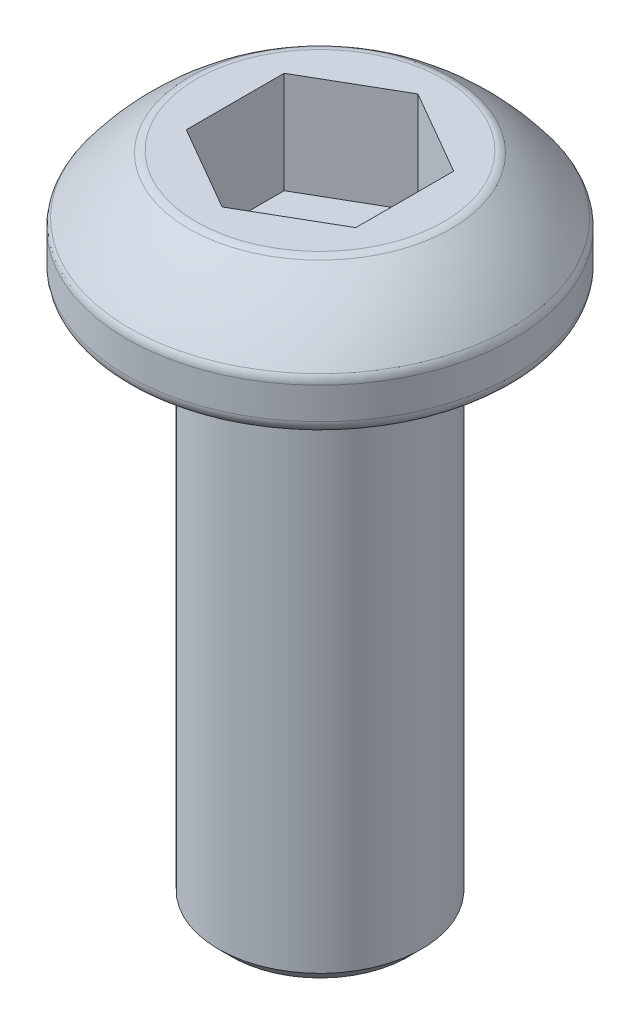
ISO-10303-21;
HEADER;
FILE_DESCRIPTION(('STEP AP214'),'2;1');
FILE_NAME('part.step','',(''),(''),'','','');
FILE_SCHEMA(('AUTOMOTIVE_DESIGN { 1 0 10303 214 1 1 1 1 }'));
ENDSEC;
DATA;
#1=APPLICATION_CONTEXT('core data for automotive mechanical design processes');
#2=APPLICATION_PROTOCOL_DEFINITION('international standard','automotive_design',2000,#1);
#3=PRODUCT_CONTEXT('',#1,'mechanical');
#4=PRODUCT('Part','Part','',(#3));
#5=PRODUCT_RELATED_PRODUCT_CATEGORY('part','',(#4));
#6=PRODUCT_DEFINITION_FORMATION('','',#4);
#7=PRODUCT_DEFINITION_CONTEXT('part definition',#1,'design');
#8=PRODUCT_DEFINITION('design','',#6,#7);
#9=PRODUCT_DEFINITION_SHAPE('','',#8);
#10=(LENGTH_UNIT() NAMED_UNIT(*) SI_UNIT(.MILLI.,.METRE.));
#11=(NAMED_UNIT(*) PLANE_ANGLE_UNIT() SI_UNIT($,.RADIAN.));
#12=(NAMED_UNIT(*) SI_UNIT($,.STERADIAN.) SOLID_ANGLE_UNIT());
#13=UNCERTAINTY_MEASURE_WITH_UNIT(LENGTH_MEASURE(1.E-05),#10,'distance_accuracy_value','');
#14=(GEOMETRIC_REPRESENTATION_CONTEXT(3) GLOBAL_UNCERTAINTY_ASSIGNED_CONTEXT((#13)) GLOBAL_UNIT_ASSIGNED_CONTEXT((#10,
#11,#12)) REPRESENTATION_CONTEXT('',''));
#15=CARTESIAN_POINT('',(0.,0.,0.));
#16=DIRECTION('',(0.,0.,1.));
#17=DIRECTION('',(1.,0.,0.));
#18=AXIS2_PLACEMENT_3D('',#15,#16,#17);
#19=CARTESIAN_POINT('',(0.,60.1595545799248,0.));
#20=DIRECTION('',(0.,1.,0.));
#21=DIRECTION('',(0.,0.,1.));
#22=AXIS2_PLACEMENT_3D('',#19,#20,#21);
#23=CYLINDRICAL_SURFACE('',#22,2.85);
#24=CARTESIAN_POINT('',(0.,0.666596043929719,0.));
#25=DIRECTION('',(0.,-1.,0.));
#26=DIRECTION('',(0.,0.,-1.));
#27=AXIS2_PLACEMENT_3D('',#24,#25,#26);
#28=CIRCLE('',#27,2.85);
#29=CARTESIAN_POINT('',(0.,0.666596043929719,-2.85));
#30=VERTEX_POINT('',#29);
#31=EDGE_CURVE('E11',#30,#30,#28,.T.);
#32=ORIENTED_EDGE('',*,*,#31,.T.);
#33=EDGE_LOOP('',(#32));
#34=FACE_BOUND('',#33,.T.);
#35=CARTESIAN_POINT('',(0.,0.2,0.));
#36=DIRECTION('',(0.,-1.,0.));
#37=DIRECTION('',(0.,0.,-1.));
#38=AXIS2_PLACEMENT_3D('',#35,#36,#37);
#39=CIRCLE('',#38,2.85);
#40=CARTESIAN_POINT('',(0.,0.2,-2.85));
#41=VERTEX_POINT('',#40);
#42=EDGE_CURVE('E127',#41,#41,#39,.F.);
#43=ORIENTED_EDGE('',*,*,#42,.T.);
#44=EDGE_LOOP('',(#43));
#45=FACE_BOUND('',#44,.T.);
#46=ADVANCED_FACE('F17',(#34,#45),#23,.T.);
#47=CARTESIAN_POINT('',(-1.5,0.,0.));
#48=DIRECTION('',(0.,-1.,0.));
#49=DIRECTION('',(0.,0.,-1.));
#50=AXIS2_PLACEMENT_3D('',#47,#48,#49);
#51=PLANE('',#50);
#52=CARTESIAN_POINT('',(0.,0.,0.));
#53=DIRECTION('',(0.,-1.,0.));
#54=DIRECTION('',(0.,0.,-1.));
#55=AXIS2_PLACEMENT_3D('',#52,#53,#54);
#56=CIRCLE('',#55,2.65);
#57=CARTESIAN_POINT('',(0.,0.,-2.65));
#58=VERTEX_POINT('',#57);
#59=EDGE_CURVE('E130',#58,#58,#56,.T.);
#60=ORIENTED_EDGE('',*,*,#59,.T.);
#61=EDGE_LOOP('',(#60));
#62=FACE_BOUND('',#61,.T.);
#63=CARTESIAN_POINT('',(0.,0.,0.));
#64=DIRECTION('',(0.,1.,0.));
#65=DIRECTION('',(0.,0.,1.));
#66=AXIS2_PLACEMENT_3D('',#63,#64,#65);
#67=CIRCLE('',#66,1.5);
#68=CARTESIAN_POINT('',(0.,0.,1.5));
#69=VERTEX_POINT('',#68);
#70=EDGE_CURVE('E119',#69,#69,#67,.T.);
#71=ORIENTED_EDGE('',*,*,#70,.T.);
#72=EDGE_LOOP('',(#71));
#73=FACE_BOUND('',#72,.T.);
#74=ADVANCED_FACE('F170',(#62,#73),#51,.T.);
#75=CARTESIAN_POINT('',(0.,60.1595545799248,0.));
#76=DIRECTION('',(0.,1.,0.));
#77=DIRECTION('',(0.,0.,1.));
#78=AXIS2_PLACEMENT_3D('',#75,#76,#77);
#79=CYLINDRICAL_SURFACE('',#78,1.5);
#80=CARTESIAN_POINT('',(0.,-7.8,0.));
#81=DIRECTION('',(0.,-1.,0.));
#82=DIRECTION('',(0.,0.,-1.));
#83=AXIS2_PLACEMENT_3D('',#80,#81,#82);
#84=CIRCLE('',#83,1.5);
#85=CARTESIAN_POINT('',(0.,-7.8,-1.5));
#86=VERTEX_POINT('',#85);
#87=EDGE_CURVE('E133',#86,#86,#84,.F.);
#88=ORIENTED_EDGE('',*,*,#87,.T.);
#89=EDGE_LOOP('',(#88));
#90=FACE_BOUND('',#89,.T.);
#91=ORIENTED_EDGE('',*,*,#70,.F.);
#92=EDGE_LOOP('',(#91));
#93=FACE_BOUND('',#92,.T.);
#94=ADVANCED_FACE('F177',(#90,#93),#79,.T.);
#95=CARTESIAN_POINT('',(0.,-8.,0.));
#96=DIRECTION('',(0.,-1.,0.));
#97=DIRECTION('',(0.,0.,-1.));
#98=AXIS2_PLACEMENT_3D('',#95,#96,#97);
#99=PLANE('',#98);
#100=CARTESIAN_POINT('',(0.,-8.,0.));
#101=DIRECTION('',(0.,-1.,0.));
#102=DIRECTION('',(0.,0.,-1.));
#103=AXIS2_PLACEMENT_3D('',#100,#101,#102);
#104=CIRCLE('',#103,1.29999999999997);
#105=CARTESIAN_POINT('',(0.,-8.,-1.29999999999997));
#106=VERTEX_POINT('',#105);
#107=EDGE_CURVE('E136',#106,#106,#104,.T.);
#108=ORIENTED_EDGE('',*,*,#107,.T.);
#109=EDGE_LOOP('',(#108));
#110=FACE_BOUND('',#109,.T.);
#111=ADVANCED_FACE('F189',(#110),#99,.T.);
#112=CARTESIAN_POINT('',(0.,0.2,0.));
#113=DIRECTION('',(0.,-1.,0.));
#114=DIRECTION('',(0.,0.,-1.));
#115=AXIS2_PLACEMENT_3D('',#112,#113,#114);
#116=TOROIDAL_SURFACE('',#115,2.65,0.2);
#117=ORIENTED_EDGE('',*,*,#59,.F.);
#118=EDGE_LOOP('',(#117));
#119=FACE_BOUND('',#118,.T.);
#120=ORIENTED_EDGE('',*,*,#42,.F.);
#121=EDGE_LOOP('',(#120));
#122=FACE_BOUND('',#121,.T.);
#123=ADVANCED_FACE('F186',(#119,#122),#116,.T.);
#124=CARTESIAN_POINT('',(0.,-7.8,0.));
#125=DIRECTION('',(0.,1.,0.));
#126=DIRECTION('',(0.,0.,1.));
#127=AXIS2_PLACEMENT_3D('',#124,#125,#126);
#128=CONICAL_SURFACE('',#127,1.5,0.78539816339746);
#129=ORIENTED_EDGE('',*,*,#107,.F.);
#130=EDGE_LOOP('',(#129));
#131=FACE_BOUND('',#130,.T.);
#132=ORIENTED_EDGE('',*,*,#87,.F.);
#133=EDGE_LOOP('',(#132));
#134=FACE_BOUND('',#133,.T.);
#135=ADVANCED_FACE('F158',(#131,#134),#128,.T.);
#136=CARTESIAN_POINT('',(0.,-1.3,0.));
#137=DIRECTION('',(0.,1.,0.));
#138=DIRECTION('',(-1.,0.,0.));
#139=AXIS2_PLACEMENT_3D('',#136,#137,#138);
#140=SPHERICAL_SURFACE('',#139,3.5);
#141=CARTESIAN_POINT('',(0.,1.61666666666667,0.));
#142=DIRECTION('',(0.,-1.,0.));
#143=DIRECTION('',(0.,0.,-1.));
#144=AXIS2_PLACEMENT_3D('',#141,#142,#143);
#145=CIRCLE('',#144,1.93469779437398);
#146=CARTESIAN_POINT('',(-1.93469779437399,1.61666666666667,0.));
#147=VERTEX_POINT('',#146);
#148=EDGE_CURVE('E142',#147,#147,#145,.T.);
#149=CARTESIAN_POINT('',(0.,0.785783682955765,0.));
#150=DIRECTION('',(0.,-1.,0.));
#151=DIRECTION('',(0.,0.,-1.));
#152=AXIS2_PLACEMENT_3D('',#149,#150,#151);
#153=CIRCLE('',#152,2.81060606060606);
#154=CARTESIAN_POINT('',(-2.81060606060605,0.785783682955765,0.));
#155=VERTEX_POINT('',#154);
#156=EDGE_CURVE('E139',#155,#155,#153,.F.);
#157=CARTESIAN_POINT('',(-1.93469779437399,1.61666666666667,0.));
#158=CARTESIAN_POINT('',(-1.94523052712988,1.60968004561565,0.));
#159=CARTESIAN_POINT('',(-1.9557254113343,1.60263636582437,0.));
#160=CARTESIAN_POINT('',(-1.97663825800548,1.58843572594383,0.));
#161=CARTESIAN_POINT('',(-1.98705622047225,1.58127876585458,0.));
#162=CARTESIAN_POINT('',(-2.00781399903341,1.56685240256066,0.));
#163=CARTESIAN_POINT('',(-2.0181538151278,1.559582999356,0.));
#164=CARTESIAN_POINT('',(-2.0387540879004,1.54493260377344,0.));
#165=CARTESIAN_POINT('',(-2.0490145445786,1.53755161139555,0.));
#166=CARTESIAN_POINT('',(-2.06945489414099,1.52267890355106,0.));
#167=CARTESIAN_POINT('',(-2.07963478702517,1.51518718808446,0.));
#168=CARTESIAN_POINT('',(-2.09991281425093,1.5000939133981,0.));
#169=CARTESIAN_POINT('',(-2.11001094859251,1.49249235417834,0.));
#170=CARTESIAN_POINT('',(-2.13012427353369,1.47718028414474,0.));
#171=CARTESIAN_POINT('',(-2.14013946413329,1.4694697733309,0.));
#172=CARTESIAN_POINT('',(-2.1600857261385,1.4539407050739,0.));
#173=CARTESIAN_POINT('',(-2.17001679754411,1.44612214763075,0.));
#174=CARTESIAN_POINT('',(-2.1897936555788,1.43037790375611,0.));
#175=CARTESIAN_POINT('',(-2.19963944220789,1.42245221732462,0.));
#176=CARTESIAN_POINT('',(-2.21924457511753,1.40649464568905,0.));
#177=CARTESIAN_POINT('',(-2.22900392139809,1.39846276048496,0.));
#178=CARTESIAN_POINT('',(-2.24843502818371,1.3822937339838,0.));
#179=CARTESIAN_POINT('',(-2.25810678868877,1.37415659268674,0.));
#180=CARTESIAN_POINT('',(-2.27736158877615,1.35777800903296,0.));
#181=CARTESIAN_POINT('',(-2.28694462835848,1.34953656667624,0.));
#182=CARTESIAN_POINT('',(-2.3060208618661,1.33295034817798,0.));
#183=CARTESIAN_POINT('',(-2.31551405579139,1.32460557203644,0.));
#184=CARTESIAN_POINT('',(-2.33440948379555,1.30781366537136,0.));
#185=CARTESIAN_POINT('',(-2.34381171787442,1.29936653484782,0.));
#186=CARTESIAN_POINT('',(-2.36252412267206,1.28237091083462,0.));
#187=CARTESIAN_POINT('',(-2.37183429339084,1.27382241734495,0.));
#188=CARTESIAN_POINT('',(-2.39036147875982,1.25662507071205,0.));
#189=CARTESIAN_POINT('',(-2.39957849341004,1.24797621756881,0.));
#190=CARTESIAN_POINT('',(-2.41791828486691,1.23057916672024,0.));
#191=CARTESIAN_POINT('',(-2.42704106167356,1.22183096901491,0.));
#192=CARTESIAN_POINT('',(-2.44519130672875,1.20423625579344,0.));
#193=CARTESIAN_POINT('',(-2.45421877497729,1.1953897402773,0.));
#194=CARTESIAN_POINT('',(-2.47217734338775,1.17759942972477,0.));
#195=CARTESIAN_POINT('',(-2.48110844354969,1.16865563468837,0.));
#196=CARTESIAN_POINT('',(-2.49887322756895,1.15067181480331,0.));
#197=CARTESIAN_POINT('',(-2.50770691142627,1.14163178995465,0.));
#198=CARTESIAN_POINT('',(-2.52527582605175,1.12345657144725,0.));
#199=CARTESIAN_POINT('',(-2.53401105681991,1.11432137778852,0.));
#200=CARTESIAN_POINT('',(-2.55138204003769,1.09595689383288,0.));
#201=CARTESIAN_POINT('',(-2.56001779248732,1.08672760353599,0.));
#202=CARTESIAN_POINT('',(-2.57718880551411,1.06817600951976,0.));
#203=CARTESIAN_POINT('',(-2.58572406609128,1.05885370580044,0.));
#204=CARTESIAN_POINT('',(-2.6026930936138,1.0401171790719,0.));
#205=CARTESIAN_POINT('',(-2.61112686055914,1.03070295606268,0.));
#206=CARTESIAN_POINT('',(-2.62789191097032,1.01178369567493,0.));
#207=CARTESIAN_POINT('',(-2.63622319443615,1.00227865829641,0.));
#208=CARTESIAN_POINT('',(-2.65278230007006,0.983178884750212,0.));
#209=CARTESIAN_POINT('',(-2.66101012223815,0.973584148582545,0.));
#210=CARTESIAN_POINT('',(-2.67736133959657,0.954306103562343,0.));
#211=CARTESIAN_POINT('',(-2.6854847347869,0.944622794709807,0.));
#212=CARTESIAN_POINT('',(-2.70162614478381,0.925168740833083,0.));
#213=CARTESIAN_POINT('',(-2.70964415959037,0.915397995808895,0.));
#214=CARTESIAN_POINT('',(-2.72557386771592,0.895770216314132,0.));
#215=CARTESIAN_POINT('',(-2.73348556103491,0.885913181843557,0.));
#216=CARTESIAN_POINT('',(-2.7492016978064,0.866113980495762,0.));
#217=CARTESIAN_POINT('',(-2.7570061412589,0.856171813618541,0.));
#218=CARTESIAN_POINT('',(-2.7725068615871,0.836203513791331,0.));
#219=CARTESIAN_POINT('',(-2.78020313846278,0.826177380841341,0.));
#220=CARTESIAN_POINT('',(-2.79548662505218,0.806042327660861,0.));
#221=CARTESIAN_POINT('',(-2.8030738347659,0.795933407430371,0.));
#222=CARTESIAN_POINT('',(-2.81060606060605,0.785783682955765,0.));
#223=B_SPLINE_CURVE_WITH_KNOTS('',3,(#157,#158,#159,#160,#161,#162,#163,#164,#165,#166,#167,
#168,#169,#170,#171,#172,#173,#174,#175,#176,#177,#178,#179,#180,#181,#182,#183,#184,#185,#186,
#187,#188,#189,#190,#191,#192,#193,#194,#195,#196,#197,#198,#199,#200,#201,#202,#203,#204,#205,
#206,#207,#208,#209,#210,#211,#212,#213,#214,#215,#216,#217,#218,#219,#220,#221,#222),
.UNSPECIFIED.,.F.,.F.,(4,2,2,2,2,2,2,2,2,2,2,2,2,2,2,2,2,2,2,2,2,2,2,2,2,2,2,2,2,2,2,2,4),(0.,
0.0379176466570755,0.0758352933141507,0.113752939971226,0.151670586628302,0.189588233285377,
0.227505879942452,0.265423526599527,0.303341173256603,0.341258819913678,0.379176466570754,
0.417094113227829,0.455011759884904,0.49292940654198,0.530847053199055,0.568764699856131,
0.606682346513206,0.644599993170282,0.682517639827357,0.720435286484432,0.758352933141508,
0.796270579798584,0.834188226455659,0.872105873112734,0.910023519769809,0.947941166426885,
0.985858813083961,1.02377645974104,1.06169410639811,1.09961175305519,1.13752939971226,
1.17544704636934,1.21336469302641),.UNSPECIFIED.);
#224=EDGE_CURVE('BSEAM155',#147,#155,#223,.T.);
#225=ORIENTED_EDGE('',*,*,#148,.T.);
#226=ORIENTED_EDGE('',*,*,#156,.T.);
#227=ORIENTED_EDGE('',*,*,#224,.T.);
#228=ORIENTED_EDGE('',*,*,#224,.F.);
#229=EDGE_LOOP('',(#225,#227,#226,#228));
#230=FACE_BOUND('',#229,.T.);
#231=ADVANCED_FACE('F155',(#230),#140,.T.);
#232=CARTESIAN_POINT('',(0.,0.15,0.));
#233=DIRECTION('',(0.,1.,0.));
#234=DIRECTION('',(0.,0.,1.));
#235=AXIS2_PLACEMENT_3D('',#232,#233,#234);
#236=PLANE('',#235);
#237=DIRECTION('',(-0.866025403784439,0.,0.5));
#238=VECTOR('',#237,1.);
#239=CARTESIAN_POINT('',(0.,0.15,-1.44337567297406));
#240=LINE('',#239,#238);
#241=CARTESIAN_POINT('',(0.,0.15,-1.44337567297406));
#242=VERTEX_POINT('',#241);
#243=CARTESIAN_POINT('',(-1.25,0.15,-0.721687836487032));
#244=VERTEX_POINT('',#243);
#245=EDGE_CURVE('E117',#242,#244,#240,.T.);
#246=ORIENTED_EDGE('',*,*,#245,.T.);
#247=DIRECTION('',(0.,0.,1.));
#248=VECTOR('',#247,1.);
#249=CARTESIAN_POINT('',(-1.25,0.15,-0.721687836487032));
#250=LINE('',#249,#248);
#251=CARTESIAN_POINT('',(-1.25,0.15,0.721687836487032));
#252=VERTEX_POINT('',#251);
#253=EDGE_CURVE('E100',#244,#252,#250,.T.);
#254=ORIENTED_EDGE('',*,*,#253,.T.);
#255=DIRECTION('',(0.866025403784439,0.,0.5));
#256=VECTOR('',#255,1.);
#257=CARTESIAN_POINT('',(-1.25,0.15,0.721687836487032));
#258=LINE('',#257,#256);
#259=CARTESIAN_POINT('',(0.,0.15,1.44337567297406));
#260=VERTEX_POINT('',#259);
#261=EDGE_CURVE('E98',#252,#260,#258,.T.);
#262=ORIENTED_EDGE('',*,*,#261,.T.);
#263=DIRECTION('',(0.866025403784439,0.,-0.5));
#264=VECTOR('',#263,1.);
#265=CARTESIAN_POINT('',(0.,0.15,1.44337567297406));
#266=LINE('',#265,#264);
#267=CARTESIAN_POINT('',(1.25,0.15,0.721687836487032));
#268=VERTEX_POINT('',#267);
#269=EDGE_CURVE('E77',#260,#268,#266,.T.);
#270=ORIENTED_EDGE('',*,*,#269,.T.);
#271=DIRECTION('',(0.,0.,-1.));
#272=VECTOR('',#271,1.);
#273=CARTESIAN_POINT('',(1.25,0.15,0.721687836487032));
#274=LINE('',#273,#272);
#275=CARTESIAN_POINT('',(1.25,0.15,-0.721687836487032));
#276=VERTEX_POINT('',#275);
#277=EDGE_CURVE('E88',#268,#276,#274,.T.);
#278=ORIENTED_EDGE('',*,*,#277,.T.);
#279=DIRECTION('',(-0.866025403784439,0.,-0.5));
#280=VECTOR('',#279,1.);
#281=CARTESIAN_POINT('',(1.25,0.15,-0.721687836487032));
#282=LINE('',#281,#280);
#283=EDGE_CURVE('E92',#276,#242,#282,.T.);
#284=ORIENTED_EDGE('',*,*,#283,.T.);
#285=EDGE_LOOP('',(#246,#254,#262,#270,#278,#284));
#286=FACE_BOUND('',#285,.T.);
#287=ADVANCED_FACE('F95',(#286),#236,.T.);
#288=CARTESIAN_POINT('',(-1.25,0.15,-0.721687836487032));
#289=DIRECTION('',(-1.,0.,0.));
#290=DIRECTION('',(0.,0.,1.));
#291=AXIS2_PLACEMENT_3D('',#288,#289,#290);
#292=PLANE('',#291);
#293=DIRECTION('',(0.,0.,1.));
#294=VECTOR('',#293,1.);
#295=CARTESIAN_POINT('',(-1.25,1.65,-0.721687836487032));
#296=LINE('',#295,#294);
#297=CARTESIAN_POINT('',(-1.25,1.65,-0.721687836487032));
#298=VERTEX_POINT('',#297);
#299=CARTESIAN_POINT('',(-1.25,1.65,0.721687836487032));
#300=VERTEX_POINT('',#299);
#301=EDGE_CURVE('E106',#298,#300,#296,.T.);
#302=ORIENTED_EDGE('',*,*,#301,.T.);
#303=DIRECTION('',(0.,1.,0.));
#304=VECTOR('',#303,1.);
#305=CARTESIAN_POINT('',(-1.25,0.15,0.721687836487032));
#306=LINE('',#305,#304);
#307=EDGE_CURVE('E122',#252,#300,#306,.T.);
#308=ORIENTED_EDGE('',*,*,#307,.F.);
#309=ORIENTED_EDGE('',*,*,#253,.F.);
#310=DIRECTION('',(0.,1.,0.));
#311=VECTOR('',#310,1.);
#312=CARTESIAN_POINT('',(-1.25,0.15,-0.721687836487032));
#313=LINE('',#312,#311);
#314=EDGE_CURVE('E62',#244,#298,#313,.T.);
#315=ORIENTED_EDGE('',*,*,#314,.T.);
#316=EDGE_LOOP('',(#302,#308,#309,#315));
#317=FACE_BOUND('',#316,.T.);
#318=ADVANCED_FACE('F214',(#317),#292,.F.);
#319=CARTESIAN_POINT('',(-1.25,0.15,0.721687836487032));
#320=DIRECTION('',(-0.5,0.,0.866025403784439));
#321=DIRECTION('',(0.866025403784439,0.,0.5));
#322=AXIS2_PLACEMENT_3D('',#319,#320,#321);
#323=PLANE('',#322);
#324=DIRECTION('',(0.866025403784439,0.,0.5));
#325=VECTOR('',#324,1.);
#326=CARTESIAN_POINT('',(-1.25,1.65,0.721687836487032));
#327=LINE('',#326,#325);
#328=CARTESIAN_POINT('',(0.,1.65,1.44337567297406));
#329=VERTEX_POINT('',#328);
#330=EDGE_CURVE('E109',#300,#329,#327,.T.);
#331=ORIENTED_EDGE('',*,*,#330,.T.);
#332=DIRECTION('',(0.,1.,0.));
#333=VECTOR('',#332,1.);
#334=CARTESIAN_POINT('',(0.,0.15,1.44337567297406));
#335=LINE('',#334,#333);
#336=EDGE_CURVE('E85',#260,#329,#335,.T.);
#337=ORIENTED_EDGE('',*,*,#336,.F.);
#338=ORIENTED_EDGE('',*,*,#261,.F.);
#339=ORIENTED_EDGE('',*,*,#307,.T.);
#340=EDGE_LOOP('',(#331,#337,#338,#339));
#341=FACE_BOUND('',#340,.T.);
#342=ADVANCED_FACE('F217',(#341),#323,.F.);
#343=CARTESIAN_POINT('',(0.,0.15,1.44337567297406));
#344=DIRECTION('',(0.5,0.,0.866025403784438));
#345=DIRECTION('',(0.866025403784439,0.,-0.5));
#346=AXIS2_PLACEMENT_3D('',#343,#344,#345);
#347=PLANE('',#346);
#348=DIRECTION('',(0.866025403784439,0.,-0.5));
#349=VECTOR('',#348,1.);
#350=CARTESIAN_POINT('',(0.,1.65,1.44337567297406));
#351=LINE('',#350,#349);
#352=CARTESIAN_POINT('',(1.25,1.65,0.721687836487032));
#353=VERTEX_POINT('',#352);
#354=EDGE_CURVE('E80',#329,#353,#351,.T.);
#355=ORIENTED_EDGE('',*,*,#354,.T.);
#356=DIRECTION('',(0.,1.,0.));
#357=VECTOR('',#356,1.);
#358=CARTESIAN_POINT('',(1.25,0.15,0.721687836487032));
#359=LINE('',#358,#357);
#360=EDGE_CURVE('E73',#268,#353,#359,.T.);
#361=ORIENTED_EDGE('',*,*,#360,.F.);
#362=ORIENTED_EDGE('',*,*,#269,.F.);
#363=ORIENTED_EDGE('',*,*,#336,.T.);
#364=EDGE_LOOP('',(#355,#361,#362,#363));
#365=FACE_BOUND('',#364,.T.);
#366=ADVANCED_FACE('F75',(#365),#347,.F.);
#367=CARTESIAN_POINT('',(1.25,0.15,0.721687836487032));
#368=DIRECTION('',(1.,0.,0.));
#369=DIRECTION('',(0.,0.,-1.));
#370=AXIS2_PLACEMENT_3D('',#367,#368,#369);
#371=PLANE('',#370);
#372=DIRECTION('',(0.,0.,-1.));
#373=VECTOR('',#372,1.);
#374=CARTESIAN_POINT('',(1.25,1.65,0.721687836487032));
#375=LINE('',#374,#373);
#376=CARTESIAN_POINT('',(1.25,1.65,-0.721687836487032));
#377=VERTEX_POINT('',#376);
#378=EDGE_CURVE('E113',#353,#377,#375,.T.);
#379=ORIENTED_EDGE('',*,*,#378,.T.);
#380=DIRECTION('',(0.,1.,0.));
#381=VECTOR('',#380,1.);
#382=CARTESIAN_POINT('',(1.25,0.15,-0.721687836487032));
#383=LINE('',#382,#381);
#384=EDGE_CURVE('E84',#276,#377,#383,.T.);
#385=ORIENTED_EDGE('',*,*,#384,.F.);
#386=ORIENTED_EDGE('',*,*,#277,.F.);
#387=ORIENTED_EDGE('',*,*,#360,.T.);
#388=EDGE_LOOP('',(#379,#385,#386,#387));
#389=FACE_BOUND('',#388,.T.);
#390=ADVANCED_FACE('F89',(#389),#371,.F.);
#391=CARTESIAN_POINT('',(1.25,0.15,-0.721687836487032));
#392=DIRECTION('',(0.5,0.,-0.866025403784439));
#393=DIRECTION('',(-0.866025403784439,0.,-0.5));
#394=AXIS2_PLACEMENT_3D('',#391,#392,#393);
#395=PLANE('',#394);
#396=DIRECTION('',(-0.866025403784439,0.,-0.5));
#397=VECTOR('',#396,1.);
#398=CARTESIAN_POINT('',(1.25,1.65,-0.721687836487032));
#399=LINE('',#398,#397);
#400=CARTESIAN_POINT('',(0.,1.65,-1.44337567297406));
#401=VERTEX_POINT('',#400);
#402=EDGE_CURVE('E115',#377,#401,#399,.T.);
#403=ORIENTED_EDGE('',*,*,#402,.T.);
#404=DIRECTION('',(0.,1.,0.));
#405=VECTOR('',#404,1.);
#406=CARTESIAN_POINT('',(0.,0.15,-1.44337567297406));
#407=LINE('',#406,#405);
#408=EDGE_CURVE('E40',#242,#401,#407,.T.);
#409=ORIENTED_EDGE('',*,*,#408,.F.);
#410=ORIENTED_EDGE('',*,*,#283,.F.);
#411=ORIENTED_EDGE('',*,*,#384,.T.);
#412=EDGE_LOOP('',(#403,#409,#410,#411));
#413=FACE_BOUND('',#412,.T.);
#414=ADVANCED_FACE('F213',(#413),#395,.F.);
#415=CARTESIAN_POINT('',(0.,0.15,-1.44337567297406));
#416=DIRECTION('',(-0.5,0.,-0.866025403784439));
#417=DIRECTION('',(-0.866025403784439,0.,0.5));
#418=AXIS2_PLACEMENT_3D('',#415,#416,#417);
#419=PLANE('',#418);
#420=DIRECTION('',(-0.866025403784439,0.,0.5));
#421=VECTOR('',#420,1.);
#422=CARTESIAN_POINT('',(0.,1.65,-1.44337567297406));
#423=LINE('',#422,#421);
#424=EDGE_CURVE('E32',#401,#298,#423,.T.);
#425=ORIENTED_EDGE('',*,*,#424,.T.);
#426=ORIENTED_EDGE('',*,*,#314,.F.);
#427=ORIENTED_EDGE('',*,*,#245,.F.);
#428=ORIENTED_EDGE('',*,*,#408,.T.);
#429=EDGE_LOOP('',(#425,#426,#427,#428));
#430=FACE_BOUND('',#429,.T.);
#431=ADVANCED_FACE('F185',(#430),#419,.F.);
#432=CARTESIAN_POINT('',(0.,1.65,0.));
#433=DIRECTION('',(0.,1.,0.));
#434=DIRECTION('',(0.,0.,1.));
#435=AXIS2_PLACEMENT_3D('',#432,#433,#434);
#436=PLANE('',#435);
#437=CARTESIAN_POINT('',(0.,1.65,0.));
#438=DIRECTION('',(0.,1.,0.));
#439=DIRECTION('',(0.,0.,1.));
#440=AXIS2_PLACEMENT_3D('',#437,#438,#439);
#441=CIRCLE('',#440,1.82414363469547);
#442=CARTESIAN_POINT('',(0.,1.65,1.82414363469547));
#443=VERTEX_POINT('',#442);
#444=EDGE_CURVE('E25',#443,#443,#441,.T.);
#445=ORIENTED_EDGE('',*,*,#444,.T.);
#446=EDGE_LOOP('',(#445));
#447=FACE_BOUND('',#446,.T.);
#448=ORIENTED_EDGE('',*,*,#424,.F.);
#449=ORIENTED_EDGE('',*,*,#402,.F.);
#450=ORIENTED_EDGE('',*,*,#378,.F.);
#451=ORIENTED_EDGE('',*,*,#354,.F.);
#452=ORIENTED_EDGE('',*,*,#330,.F.);
#453=ORIENTED_EDGE('',*,*,#301,.F.);
#454=EDGE_LOOP('',(#448,#449,#450,#451,#452,#453));
#455=FACE_BOUND('',#454,.T.);
#456=ADVANCED_FACE('F147',(#447,#455),#436,.T.);
#457=CARTESIAN_POINT('',(0.,1.45,0.));
#458=DIRECTION('',(0.,1.,0.));
#459=DIRECTION('',(0.,0.,1.));
#460=AXIS2_PLACEMENT_3D('',#457,#458,#459);
#461=TOROIDAL_SURFACE('',#460,1.82414363469547,0.2);
#462=ORIENTED_EDGE('',*,*,#444,.F.);
#463=EDGE_LOOP('',(#462));
#464=FACE_BOUND('',#463,.T.);
#465=ORIENTED_EDGE('',*,*,#148,.F.);
#466=EDGE_LOOP('',(#465));
#467=FACE_BOUND('',#466,.T.);
#468=ADVANCED_FACE('F150',(#464,#467),#461,.T.);
#469=CARTESIAN_POINT('',(0.,0.666596043929721,0.));
#470=DIRECTION('',(0.,-1.,0.));
#471=DIRECTION('',(0.,0.,-1.));
#472=AXIS2_PLACEMENT_3D('',#469,#470,#471);
#473=TOROIDAL_SURFACE('',#472,2.65,0.2);
#474=ORIENTED_EDGE('',*,*,#31,.F.);
#475=EDGE_LOOP('',(#474));
#476=FACE_BOUND('',#475,.T.);
#477=ORIENTED_EDGE('',*,*,#156,.F.);
#478=EDGE_LOOP('',(#477));
#479=FACE_BOUND('',#478,.T.);
#480=ADVANCED_FACE('F19',(#476,#479),#473,.T.);
#481=CLOSED_SHELL('',(#46,#74,#94,#111,#123,#135,#231,#287,#318,#342,#366,#390,#414,#431,#456,
#468,#480));
#482=MANIFOLD_SOLID_BREP('B1',#481);
#483=ADVANCED_BREP_SHAPE_REPRESENTATION('',(#18,#482),#14);
#484=SHAPE_DEFINITION_REPRESENTATION(#9,#483);
ENDSEC;
END-ISO-10303-21;
